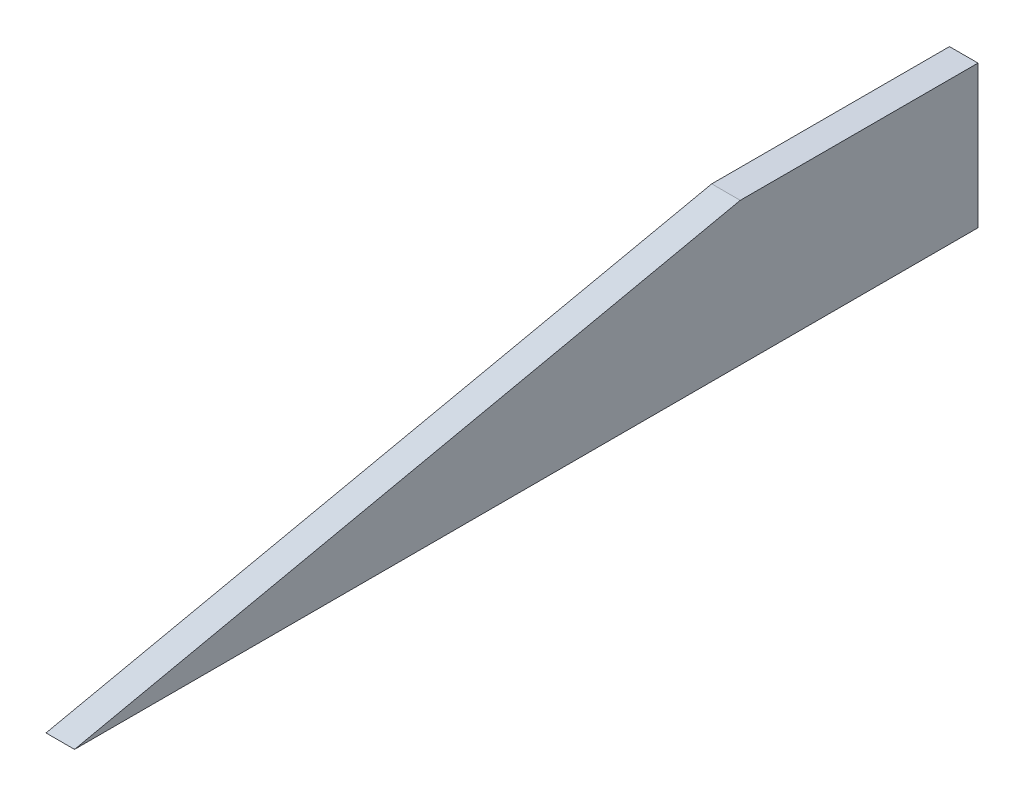
ISO-10303-21;
HEADER;
FILE_DESCRIPTION(('STEP AP214'),'2;1');
FILE_NAME('part.step','',(''),(''),'','','');
FILE_SCHEMA(('AUTOMOTIVE_DESIGN { 1 0 10303 214 1 1 1 1 }'));
ENDSEC;
DATA;
#1=APPLICATION_CONTEXT('core data for automotive mechanical design processes');
#2=APPLICATION_PROTOCOL_DEFINITION('international standard','automotive_design',2000,#1);
#3=PRODUCT_CONTEXT('',#1,'mechanical');
#4=PRODUCT('Part','Part','',(#3));
#5=PRODUCT_RELATED_PRODUCT_CATEGORY('part','',(#4));
#6=PRODUCT_DEFINITION_FORMATION('','',#4);
#7=PRODUCT_DEFINITION_CONTEXT('part definition',#1,'design');
#8=PRODUCT_DEFINITION('design','',#6,#7);
#9=PRODUCT_DEFINITION_SHAPE('','',#8);
#10=(LENGTH_UNIT() NAMED_UNIT(*) SI_UNIT(.MILLI.,.METRE.));
#11=(NAMED_UNIT(*) PLANE_ANGLE_UNIT() SI_UNIT($,.RADIAN.));
#12=(NAMED_UNIT(*) SI_UNIT($,.STERADIAN.) SOLID_ANGLE_UNIT());
#13=UNCERTAINTY_MEASURE_WITH_UNIT(LENGTH_MEASURE(1.E-05),#10,'distance_accuracy_value','');
#14=(GEOMETRIC_REPRESENTATION_CONTEXT(3) GLOBAL_UNCERTAINTY_ASSIGNED_CONTEXT((#13)) GLOBAL_UNIT_ASSIGNED_CONTEXT((#10,
#11,#12)) REPRESENTATION_CONTEXT('',''));
#15=CARTESIAN_POINT('',(0.,0.,0.));
#16=DIRECTION('',(0.,0.,1.));
#17=DIRECTION('',(1.,0.,0.));
#18=AXIS2_PLACEMENT_3D('',#15,#16,#17);
#19=CARTESIAN_POINT('',(0.,-0.0100000000000922,-150.01));
#20=DIRECTION('',(-1.,0.,0.));
#21=DIRECTION('',(0.,0.,1.));
#22=AXIS2_PLACEMENT_3D('',#19,#20,#21);
#23=PLANE('',#22);
#24=DIRECTION('',(0.,-0.209529088730873,0.97780241407741));
#25=VECTOR('',#24,1.);
#26=CARTESIAN_POINT('',(0.,74.9999999999998,450.));
#27=LINE('',#26,#25);
#28=CARTESIAN_POINT('',(0.,150.,100.));
#29=VERTEX_POINT('',#28);
#30=CARTESIAN_POINT('',(0.,0.,800.));
#31=VERTEX_POINT('',#30);
#32=EDGE_CURVE('E82',#29,#31,#27,.T.);
#33=ORIENTED_EDGE('',*,*,#32,.F.);
#34=DIRECTION('',(0.,0.,1.));
#35=VECTOR('',#34,1.);
#36=CARTESIAN_POINT('',(0.,150.,-25.));
#37=LINE('',#36,#35);
#38=CARTESIAN_POINT('',(0.,150.,-150.));
#39=VERTEX_POINT('',#38);
#40=EDGE_CURVE('E85',#39,#29,#37,.T.);
#41=ORIENTED_EDGE('',*,*,#40,.F.);
#42=DIRECTION('',(0.,1.,0.));
#43=VECTOR('',#42,1.);
#44=CARTESIAN_POINT('',(0.,75.,-150.));
#45=LINE('',#44,#43);
#46=CARTESIAN_POINT('',(0.,0.,-150.));
#47=VERTEX_POINT('',#46);
#48=EDGE_CURVE('E83',#47,#39,#45,.T.);
#49=ORIENTED_EDGE('',*,*,#48,.F.);
#50=DIRECTION('',(0.,0.,-1.));
#51=VECTOR('',#50,1.);
#52=CARTESIAN_POINT('',(0.,0.,325.));
#53=LINE('',#52,#51);
#54=EDGE_CURVE('E76',#31,#47,#53,.T.);
#55=ORIENTED_EDGE('',*,*,#54,.F.);
#56=EDGE_LOOP('',(#33,#41,#49,#55));
#57=FACE_BOUND('',#56,.T.);
#58=ADVANCED_FACE('F17',(#57),#23,.T.);
#59=CARTESIAN_POINT('',(-0.01,-0.00999999999999446,-150.));
#60=DIRECTION('',(0.,0.,-1.));
#61=DIRECTION('',(0.,1.,0.));
#62=AXIS2_PLACEMENT_3D('',#59,#60,#61);
#63=PLANE('',#62);
#64=DIRECTION('',(0.,1.,0.));
#65=VECTOR('',#64,1.);
#66=CARTESIAN_POINT('',(30.,75.,-150.));
#67=LINE('',#66,#65);
#68=CARTESIAN_POINT('',(30.,0.,-150.));
#69=VERTEX_POINT('',#68);
#70=CARTESIAN_POINT('',(30.,150.,-150.));
#71=VERTEX_POINT('',#70);
#72=EDGE_CURVE('E61',#69,#71,#67,.T.);
#73=ORIENTED_EDGE('',*,*,#72,.F.);
#74=DIRECTION('',(1.,0.,0.));
#75=VECTOR('',#74,1.);
#76=CARTESIAN_POINT('',(15.,0.,-150.));
#77=LINE('',#76,#75);
#78=EDGE_CURVE('E65',#47,#69,#77,.T.);
#79=ORIENTED_EDGE('',*,*,#78,.F.);
#80=ORIENTED_EDGE('',*,*,#48,.T.);
#81=DIRECTION('',(-1.,0.,0.));
#82=VECTOR('',#81,1.);
#83=CARTESIAN_POINT('',(15.,150.,-150.));
#84=LINE('',#83,#82);
#85=EDGE_CURVE('E68',#71,#39,#84,.T.);
#86=ORIENTED_EDGE('',*,*,#85,.F.);
#87=EDGE_LOOP('',(#73,#79,#80,#86));
#88=FACE_BOUND('',#87,.T.);
#89=ADVANCED_FACE('F63',(#88),#63,.T.);
#90=CARTESIAN_POINT('',(-0.01,150.,-150.01));
#91=DIRECTION('',(0.,1.,0.));
#92=DIRECTION('',(0.,0.,1.));
#93=AXIS2_PLACEMENT_3D('',#90,#91,#92);
#94=PLANE('',#93);
#95=DIRECTION('',(0.,0.,1.));
#96=VECTOR('',#95,1.);
#97=CARTESIAN_POINT('',(30.,150.,325.));
#98=LINE('',#97,#96);
#99=CARTESIAN_POINT('',(30.,150.,100.));
#100=VERTEX_POINT('',#99);
#101=EDGE_CURVE('E71',#71,#100,#98,.T.);
#102=ORIENTED_EDGE('',*,*,#101,.F.);
#103=ORIENTED_EDGE('',*,*,#85,.T.);
#104=ORIENTED_EDGE('',*,*,#40,.T.);
#105=DIRECTION('',(-1.,0.,0.));
#106=VECTOR('',#105,1.);
#107=CARTESIAN_POINT('',(15.,150.,99.9999999999999));
#108=LINE('',#107,#106);
#109=EDGE_CURVE('E40',#100,#29,#108,.T.);
#110=ORIENTED_EDGE('',*,*,#109,.F.);
#111=EDGE_LOOP('',(#102,#103,#104,#110));
#112=FACE_BOUND('',#111,.T.);
#113=ADVANCED_FACE('F91',(#112),#94,.T.);
#114=CARTESIAN_POINT('',(-0.01,150.002095290887,99.9902219758592));
#115=DIRECTION('',(0.,0.97780241407741,0.209529088730873));
#116=DIRECTION('',(0.,-0.209529088730873,0.97780241407741));
#117=AXIS2_PLACEMENT_3D('',#114,#115,#116);
#118=PLANE('',#117);
#119=DIRECTION('',(0.,-0.209529088730874,0.97780241407741));
#120=VECTOR('',#119,1.);
#121=CARTESIAN_POINT('',(30.,150.,100.));
#122=LINE('',#121,#120);
#123=CARTESIAN_POINT('',(30.,0.,800.000000000001));
#124=VERTEX_POINT('',#123);
#125=EDGE_CURVE('E21',#100,#124,#122,.T.);
#126=ORIENTED_EDGE('',*,*,#125,.F.);
#127=ORIENTED_EDGE('',*,*,#109,.T.);
#128=ORIENTED_EDGE('',*,*,#32,.T.);
#129=DIRECTION('',(-1.,0.,0.));
#130=VECTOR('',#129,1.);
#131=CARTESIAN_POINT('',(15.,0.,800.));
#132=LINE('',#131,#130);
#133=EDGE_CURVE('E32',#124,#31,#132,.T.);
#134=ORIENTED_EDGE('',*,*,#133,.F.);
#135=EDGE_LOOP('',(#126,#127,#128,#134));
#136=FACE_BOUND('',#135,.T.);
#137=ADVANCED_FACE('F89',(#136),#118,.T.);
#138=CARTESIAN_POINT('',(-0.01,0.,800.01));
#139=DIRECTION('',(0.,-1.,0.));
#140=DIRECTION('',(0.,0.,-1.));
#141=AXIS2_PLACEMENT_3D('',#138,#139,#140);
#142=PLANE('',#141);
#143=DIRECTION('',(0.,0.,-1.));
#144=VECTOR('',#143,1.);
#145=CARTESIAN_POINT('',(30.,0.,325.));
#146=LINE('',#145,#144);
#147=EDGE_CURVE('E11',#124,#69,#146,.T.);
#148=ORIENTED_EDGE('',*,*,#147,.F.);
#149=ORIENTED_EDGE('',*,*,#133,.T.);
#150=ORIENTED_EDGE('',*,*,#54,.T.);
#151=ORIENTED_EDGE('',*,*,#78,.T.);
#152=EDGE_LOOP('',(#148,#149,#150,#151));
#153=FACE_BOUND('',#152,.T.);
#154=ADVANCED_FACE('F74',(#153),#142,.T.);
#155=CARTESIAN_POINT('',(30.,-0.0100000000000922,800.01));
#156=DIRECTION('',(1.,0.,0.));
#157=DIRECTION('',(0.,0.,-1.));
#158=AXIS2_PLACEMENT_3D('',#155,#156,#157);
#159=PLANE('',#158);
#160=ORIENTED_EDGE('',*,*,#125,.T.);
#161=ORIENTED_EDGE('',*,*,#147,.T.);
#162=ORIENTED_EDGE('',*,*,#72,.T.);
#163=ORIENTED_EDGE('',*,*,#101,.T.);
#164=EDGE_LOOP('',(#160,#161,#162,#163));
#165=FACE_BOUND('',#164,.T.);
#166=ADVANCED_FACE('F19',(#165),#159,.T.);
#167=CLOSED_SHELL('',(#58,#89,#113,#137,#154,#166));
#168=MANIFOLD_SOLID_BREP('B1',#167);
#169=ADVANCED_BREP_SHAPE_REPRESENTATION('',(#18,#168),#14);
#170=SHAPE_DEFINITION_REPRESENTATION(#9,#169);
ENDSEC;
END-ISO-10303-21;
